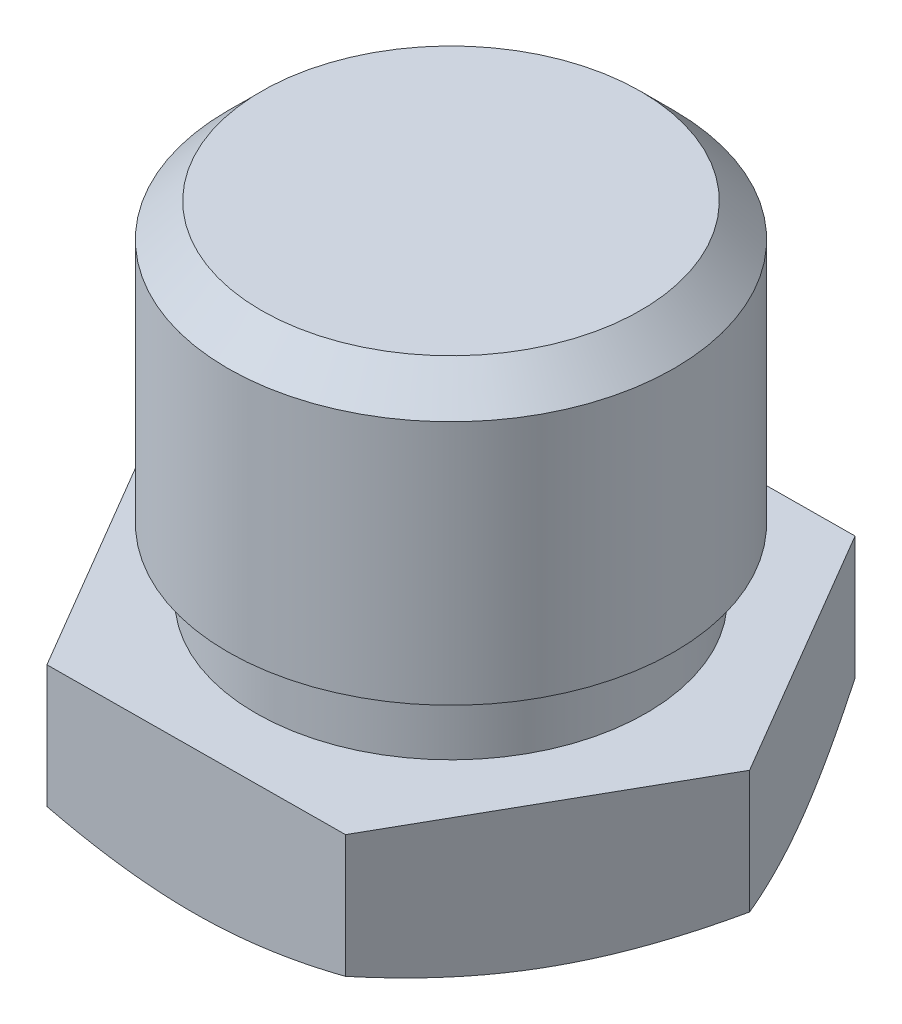
ISO-10303-21;
HEADER;
FILE_DESCRIPTION(('STEP AP214'),'2;1');
FILE_NAME('part.step','',(''),(''),'','','');
FILE_SCHEMA(('AUTOMOTIVE_DESIGN { 1 0 10303 214 1 1 1 1 }'));
ENDSEC;
DATA;
#1=APPLICATION_CONTEXT('core data for automotive mechanical design processes');
#2=APPLICATION_PROTOCOL_DEFINITION('international standard','automotive_design',2000,#1);
#3=PRODUCT_CONTEXT('',#1,'mechanical');
#4=PRODUCT('Part','Part','',(#3));
#5=PRODUCT_RELATED_PRODUCT_CATEGORY('part','',(#4));
#6=PRODUCT_DEFINITION_FORMATION('','',#4);
#7=PRODUCT_DEFINITION_CONTEXT('part definition',#1,'design');
#8=PRODUCT_DEFINITION('design','',#6,#7);
#9=PRODUCT_DEFINITION_SHAPE('','',#8);
#10=(LENGTH_UNIT() NAMED_UNIT(*) SI_UNIT(.MILLI.,.METRE.));
#11=(NAMED_UNIT(*) PLANE_ANGLE_UNIT() SI_UNIT($,.RADIAN.));
#12=(NAMED_UNIT(*) SI_UNIT($,.STERADIAN.) SOLID_ANGLE_UNIT());
#13=UNCERTAINTY_MEASURE_WITH_UNIT(LENGTH_MEASURE(1.E-05),#10,'distance_accuracy_value','');
#14=(GEOMETRIC_REPRESENTATION_CONTEXT(3) GLOBAL_UNCERTAINTY_ASSIGNED_CONTEXT((#13)) GLOBAL_UNIT_ASSIGNED_CONTEXT((#10,
#11,#12)) REPRESENTATION_CONTEXT('',''));
#15=CARTESIAN_POINT('',(0.,0.,0.));
#16=DIRECTION('',(0.,0.,1.));
#17=DIRECTION('',(1.,0.,0.));
#18=AXIS2_PLACEMENT_3D('',#15,#16,#17);
#19=CARTESIAN_POINT('',(13.2786844152626,6.5,-0.0993656540089263));
#20=DIRECTION('',(-0.862259714880802,0.,0.506466370150751));
#21=DIRECTION('',(0.506466370150751,0.,0.862259714880802));
#22=AXIS2_PLACEMENT_3D('',#19,#20,#21);
#23=PLANE('',#22);
#24=DIRECTION('',(0.,-1.,0.));
#25=VECTOR('',#24,1.);
#26=CARTESIAN_POINT('',(13.2786844152626,6.5,-0.0993656540089263));
#27=LINE('',#26,#25);
#28=CARTESIAN_POINT('',(13.2786844152626,6.5,-0.0993656540089263));
#29=VERTEX_POINT('',#28);
#30=CARTESIAN_POINT('',(13.2786844152626,0.999999999999913,-0.0993656540089263));
#31=VERTEX_POINT('',#30);
#32=EDGE_CURVE('E104',#29,#31,#27,.T.);
#33=ORIENTED_EDGE('',*,*,#32,.T.);
#34=CARTESIAN_POINT('',(13.278801889467,1.00005798792879,-0.0991656540089266));
#35=CARTESIAN_POINT('',(13.0892477828478,0.906495480012444,-0.421881789888406));
#36=CARTESIAN_POINT('',(12.8989551950581,0.818485549010916,-0.745855191010019));
#37=CARTESIAN_POINT('',(12.5168543572176,0.655424160118906,-1.39638241040671));
#38=CARTESIAN_POINT('',(12.3250453794867,0.580379375303605,-1.72293746755796));
#39=CARTESIAN_POINT('',(11.9397828409977,0.445101486414631,-2.37884748680155));
#40=CARTESIAN_POINT('',(11.7463272663629,0.384890468454874,-2.70820587752167));
#41=CARTESIAN_POINT('',(11.3582872115426,0.281279927851655,-3.36884462226612));
#42=CARTESIAN_POINT('',(11.1637029318079,0.237877507605416,-3.70012463502266));
#43=CARTESIAN_POINT('',(10.7781213489979,0.170174920080449,-4.35657782767609));
#44=CARTESIAN_POINT('',(10.5871427365605,0.145463994403388,-4.68171918673529));
#45=CARTESIAN_POINT('',(10.2047880025491,0.114463177060262,-5.33267866472373));
#46=CARTESIAN_POINT('',(10.0134118618347,0.108174193966666,-5.65849681623943));
#47=CARTESIAN_POINT('',(9.6309432470842,0.114261147632678,-6.30965017634794));
#48=CARTESIAN_POINT('',(9.43985068958976,0.126616979719078,-6.63498552702868));
#49=CARTESIAN_POINT('',(9.05821021566678,0.169480274015968,-7.28472897620153));
#50=CARTESIAN_POINT('',(8.86766225419606,0.199986188699251,-7.60913715137802));
#51=CARTESIAN_POINT('',(8.49944267573429,0.275586286577359,-8.23603150695678));
#52=CARTESIAN_POINT('',(8.32171553673145,0.319641320413002,-8.53861221366305));
#53=CARTESIAN_POINT('',(7.96725959631279,0.421466529051991,-9.14207395591501));
#54=CARTESIAN_POINT('',(7.7905309034253,0.479238166525155,-9.44295480669108));
#55=CARTESIAN_POINT('',(7.43626366329683,0.607771425592251,-10.0460952864308));
#56=CARTESIAN_POINT('',(7.25873805796857,0.67867070482349,-10.3483328817698));
#57=CARTESIAN_POINT('',(6.90498939101579,0.831480584190287,-10.950590489941));
#58=CARTESIAN_POINT('',(6.72876576088822,0.913386036987412,-11.2506114706506));
#59=CARTESIAN_POINT('',(6.55317155279144,1.00005798792881,-11.5495608594584));
#60=B_SPLINE_CURVE_WITH_KNOTS('',3,(#34,#35,#36,#37,#38,#39,#40,#41,#42,#43,#44,#45,#46,#47,#48,
#49,#50,#51,#52,#53,#54,#55,#56,#57,#58,#59),.UNSPECIFIED.,.F.,.F.,(4,2,2,2,2,2,2,2,2,2,2,2,4),
(0.,1.15741546007654,2.31542487092911,3.47514817024263,4.63467145793502,5.76790726441043,
6.901198961274,8.03326950451839,9.16524353806669,10.2259639835277,11.2867975897379,
12.3594596383154,13.4316217618208),.UNSPECIFIED.);
#61=CARTESIAN_POINT('',(6.55328902699588,0.999999999999936,-11.5493608594584));
#62=VERTEX_POINT('',#61);
#63=EDGE_CURVE('E53',#31,#62,#60,.T.);
#64=ORIENTED_EDGE('',*,*,#63,.T.);
#65=DIRECTION('',(0.,-1.,0.));
#66=VECTOR('',#65,1.);
#67=CARTESIAN_POINT('',(6.55328902699589,6.5,-11.5493608594584));
#68=LINE('',#67,#66);
#69=CARTESIAN_POINT('',(6.55328902699589,6.5,-11.5493608594584));
#70=VERTEX_POINT('',#69);
#71=EDGE_CURVE('E103',#70,#62,#68,.T.);
#72=ORIENTED_EDGE('',*,*,#71,.F.);
#73=DIRECTION('',(-0.506466370150751,0.,-0.862259714880802));
#74=VECTOR('',#73,1.);
#75=CARTESIAN_POINT('',(13.2786844152626,6.5,-0.0993656540089263));
#76=LINE('',#75,#74);
#77=EDGE_CURVE('E132',#29,#70,#76,.T.);
#78=ORIENTED_EDGE('',*,*,#77,.F.);
#79=EDGE_LOOP('',(#33,#64,#72,#78));
#80=FACE_BOUND('',#79,.T.);
#81=ADVANCED_FACE('F38',(#80),#23,.F.);
#82=CARTESIAN_POINT('',(6.55328902699589,6.5,-11.5493608594584));
#83=DIRECTION('',(0.00748288527264228,0.,0.999972002822077));
#84=DIRECTION('',(0.999972002822077,0.,-0.00748288527264229));
#85=AXIS2_PLACEMENT_3D('',#82,#83,#84);
#86=PLANE('',#85);
#87=ORIENTED_EDGE('',*,*,#71,.T.);
#88=CARTESIAN_POINT('',(6.55348902699589,1.00005000196466,-11.5493623560773));
#89=CARTESIAN_POINT('',(6.17923229772127,0.906488004955447,-11.5465617575008));
#90=CARTESIAN_POINT('',(5.80351750874437,0.818478587991021,-11.5437502481253));
#91=CARTESIAN_POINT('',(5.04909540759903,0.655418223151411,-11.5381048360397));
#92=CARTESIAN_POINT('',(4.67038665870723,0.580373948311718,-11.5352709225784));
#93=CARTESIAN_POINT('',(3.90972211150778,0.445097066884958,-11.5295787976773));
#94=CARTESIAN_POINT('',(3.52776233709572,0.384886545907937,-11.5267205564839));
#95=CARTESIAN_POINT('',(2.76161388734343,0.281276966483241,-11.5209873950203));
#96=CARTESIAN_POINT('',(2.37742560777006,0.237875010449097,-11.5181124777116));
#97=CARTESIAN_POINT('',(1.61613116407676,0.170173285486741,-11.5124156392353));
#98=CARTESIAN_POINT('',(1.23906190221761,0.145462761642441,-11.5095939942109));
#99=CARTESIAN_POINT('',(0.484138552019265,0.114462686189678,-11.5039448312311));
#100=CARTESIAN_POINT('',(0.106284425889888,0.108174043157357,-11.5011173129929));
#101=CARTESIAN_POINT('',(-0.648863742889136,0.114261600739779,-11.4954664676744));
#102=CARTESIAN_POINT('',(-1.02615795033378,0.126617696996423,-11.4926431393608));
#103=CARTESIAN_POINT('',(-1.77967101273376,0.16948143639026,-11.4870045296983));
#104=CARTESIAN_POINT('',(-2.15588995662197,0.199987531999137,-11.4841892476838));
#105=CARTESIAN_POINT('',(-2.88290153838933,0.275587568352364,-11.4787489511126));
#106=CARTESIAN_POINT('',(-3.23380381381667,0.319642229755087,-11.4761231161277));
#107=CARTESIAN_POINT('',(-3.93363727744409,0.421466387743175,-11.4708861959905));
#108=CARTESIAN_POINT('',(-4.28256825138991,0.47923734682663,-11.4682751124414));
#109=CARTESIAN_POINT('',(-4.98202913527991,0.607768971979282,-11.4630409803536));
#110=CARTESIAN_POINT('',(-5.33253349355472,0.678667290738526,-11.4604181230205));
#111=CARTESIAN_POINT('',(-6.03097051886239,0.831475033525346,-11.4551916525635));
#112=CARTESIAN_POINT('',(-6.37890430827846,0.913379310541671,-11.4525880310408));
#113=CARTESIAN_POINT('',(-6.72559538826666,1.00005000196464,-11.4499937088305));
#114=B_SPLINE_CURVE_WITH_KNOTS('',3,(#88,#89,#90,#91,#92,#93,#94,#95,#96,#97,#98,#99,#100,#101,
#102,#103,#104,#105,#106,#107,#108,#109,#110,#111,#112,#113),.UNSPECIFIED.,.F.,.F.,(4,2,2,2,2,2,
2,2,2,2,2,2,4),(0.,1.15741306233225,2.31542007088461,3.47514092704066,4.63466177273383,
5.76789534332623,6.90118480460978,8.03325312886427,9.16522494310022,10.225933731874,
11.2867556693873,12.3594057431476,13.4315559193472),.UNSPECIFIED.);
#115=CARTESIAN_POINT('',(-6.72539538826666,0.999999999999913,-11.4499952054494));
#116=VERTEX_POINT('',#115);
#117=EDGE_CURVE('E90',#62,#116,#114,.T.);
#118=ORIENTED_EDGE('',*,*,#117,.T.);
#119=DIRECTION('',(0.,-1.,0.));
#120=VECTOR('',#119,1.);
#121=CARTESIAN_POINT('',(-6.72539538826666,6.5,-11.4499952054494));
#122=LINE('',#121,#120);
#123=CARTESIAN_POINT('',(-6.72539538826666,6.5,-11.4499952054494));
#124=VERTEX_POINT('',#123);
#125=EDGE_CURVE('E109',#124,#116,#122,.T.);
#126=ORIENTED_EDGE('',*,*,#125,.F.);
#127=DIRECTION('',(-0.999972002822077,0.,0.00748288527264229));
#128=VECTOR('',#127,1.);
#129=CARTESIAN_POINT('',(6.55328902699589,6.5,-11.5493608594584));
#130=LINE('',#129,#128);
#131=EDGE_CURVE('E108',#70,#124,#130,.T.);
#132=ORIENTED_EDGE('',*,*,#131,.F.);
#133=EDGE_LOOP('',(#87,#118,#126,#132));
#134=FACE_BOUND('',#133,.T.);
#135=ADVANCED_FACE('F107',(#134),#86,.F.);
#136=CARTESIAN_POINT('',(-6.72539538826666,6.5,-11.4499952054494));
#137=DIRECTION('',(0.869742600153444,0.,0.493505632671326));
#138=DIRECTION('',(0.493505632671326,0.,-0.869742600153445));
#139=AXIS2_PLACEMENT_3D('',#136,#137,#138);
#140=PLANE('',#139);
#141=ORIENTED_EDGE('',*,*,#125,.T.);
#142=CARTESIAN_POINT('',(-6.72528190512059,1.00005748901951,-11.4501952054494));
#143=CARTESIAN_POINT('',(-6.90998520223733,0.906495013021198,-11.1246785036001));
#144=CARTESIAN_POINT('',(-7.0954080822684,0.818485114133238,-10.7978936259216));
#145=CARTESIAN_POINT('',(-7.46773071755255,0.655423789217099,-10.1417210607673));
#146=CARTESIAN_POINT('',(-7.65463118186342,0.580379036261622,-9.81233212366499));
#147=CARTESIAN_POINT('',(-8.0300346068258,0.445101210312064,-9.15073004798871));
#148=CARTESIAN_POINT('',(-8.21853952981428,0.384890223400421,-8.81851345103871));
#149=CARTESIAN_POINT('',(-8.59664939141831,0.281279742845111,-8.15214161573655));
#150=CARTESIAN_POINT('',(-8.78625413471284,0.237877351599687,-7.81798672161351));
#151=CARTESIAN_POINT('',(-9.16196843863417,0.170174817961751,-7.15583676024718));
#152=CARTESIAN_POINT('',(-9.34805978694809,0.145463917388455,-6.82787378995135));
#153=CARTESIAN_POINT('',(-9.72062981965142,0.11446314639355,-6.17126521746428));
#154=CARTESIAN_POINT('',(-9.90710852269132,0.108174184544641,-5.84261958240385));
#155=CARTESIAN_POINT('',(-10.2797895209837,0.114261175939173,-5.18581544679942));
#156=CARTESIAN_POINT('',(-10.4659918975592,0.12661702452909,-4.85765680293364));
#157=CARTESIAN_POINT('',(-10.8378659470453,0.169480346632508,-4.20227481473041));
#158=CARTESIAN_POINT('',(-11.0235376638455,0.199986272618733,-3.87505139304302));
#159=CARTESIAN_POINT('',(-11.3823341688252,0.275586366653234,-3.24271695852426));
#160=CARTESIAN_POINT('',(-11.5555130586223,0.319641377221881,-2.93751059828783));
#161=CARTESIAN_POINT('',(-11.9008980498391,0.421466520223448,-2.32881229693535));
#162=CARTESIAN_POINT('',(-12.0731040455087,0.479238115315458,-2.02532054219103));
#163=CARTESIAN_POINT('',(-12.4183051651242,0.607771272306696,-1.41694629177955));
#164=CARTESIAN_POINT('',(-12.5912876783775,0.678670491534158,-1.11208602089748));
#165=CARTESIAN_POINT('',(-12.9359834959049,0.831480237421918,-0.504602302878869));
#166=CARTESIAN_POINT('',(-13.1076973541314,0.913385616764226,-0.201977879469661));
#167=CARTESIAN_POINT('',(-13.2787978984086,1.00005748901945,0.0995656540089277));
#168=B_SPLINE_CURVE_WITH_KNOTS('',3,(#142,#143,#144,#145,#146,#147,#148,#149,#150,#151,#152,
#153,#154,#155,#156,#157,#158,#159,#160,#161,#162,#163,#164,#165,#166,#167),.UNSPECIFIED.,.F.,
.F.,(4,2,2,2,2,2,2,2,2,2,2,2,4),(0.,1.15741531028125,2.31542457105391,3.47514771773503,
4.63467085286736,5.76790651965949,6.90119807685872,8.03326848147521,9.16524237637546,
10.2259620936075,11.2867949708385,12.3594562713123,13.4316176484328),.UNSPECIFIED.);
#169=CARTESIAN_POINT('',(-13.2786844152626,0.999999999999867,0.0993656540089118));
#170=VERTEX_POINT('',#169);
#171=EDGE_CURVE('E93',#116,#170,#168,.T.);
#172=ORIENTED_EDGE('',*,*,#171,.T.);
#173=DIRECTION('',(0.,-1.,0.));
#174=VECTOR('',#173,1.);
#175=CARTESIAN_POINT('',(-13.2786844152625,6.5,0.0993656540089282));
#176=LINE('',#175,#174);
#177=CARTESIAN_POINT('',(-13.2786844152625,6.5,0.0993656540089282));
#178=VERTEX_POINT('',#177);
#179=EDGE_CURVE('E112',#178,#170,#176,.T.);
#180=ORIENTED_EDGE('',*,*,#179,.F.);
#181=DIRECTION('',(-0.493505632671326,0.,0.869742600153444));
#182=VECTOR('',#181,1.);
#183=CARTESIAN_POINT('',(-6.72539538826666,6.5,-11.4499952054494));
#184=LINE('',#183,#182);
#185=EDGE_CURVE('E129',#124,#178,#184,.T.);
#186=ORIENTED_EDGE('',*,*,#185,.F.);
#187=EDGE_LOOP('',(#141,#172,#180,#186));
#188=FACE_BOUND('',#187,.T.);
#189=ADVANCED_FACE('F186',(#188),#140,.F.);
#190=CARTESIAN_POINT('',(-13.2786844152625,6.5,0.0993656540089282));
#191=DIRECTION('',(0.862259714880802,0.,-0.506466370150751));
#192=DIRECTION('',(-0.506466370150751,0.,-0.862259714880802));
#193=AXIS2_PLACEMENT_3D('',#190,#191,#192);
#194=PLANE('',#193);
#195=ORIENTED_EDGE('',*,*,#179,.T.);
#196=CARTESIAN_POINT('',(-13.278801889467,1.00005798792873,0.0991656540089284));
#197=CARTESIAN_POINT('',(-13.0892477828478,0.906495480012392,0.421881789888409));
#198=CARTESIAN_POINT('',(-12.8989551950581,0.818485549010863,0.745855191010022));
#199=CARTESIAN_POINT('',(-12.5168543572176,0.655424160118849,1.39638241040671));
#200=CARTESIAN_POINT('',(-12.3250453794867,0.580379375303546,1.72293746755796));
#201=CARTESIAN_POINT('',(-11.9397828409977,0.44510148641457,2.37884748680155));
#202=CARTESIAN_POINT('',(-11.7463272663629,0.384890468454813,2.70820587752167));
#203=CARTESIAN_POINT('',(-11.3582872115426,0.281279927851592,3.36884462226613));
#204=CARTESIAN_POINT('',(-11.1637029318079,0.237877507605351,3.70012463502267));
#205=CARTESIAN_POINT('',(-10.7781213489979,0.170174920080382,4.3565778276761));
#206=CARTESIAN_POINT('',(-10.5871427365605,0.14546399440332,4.6817191867353));
#207=CARTESIAN_POINT('',(-10.2047880025491,0.114463177060191,5.33267866472375));
#208=CARTESIAN_POINT('',(-10.0134118618347,0.108174193966594,5.65849681623944));
#209=CARTESIAN_POINT('',(-9.63094324708419,0.114261147632604,6.30965017634795));
#210=CARTESIAN_POINT('',(-9.43985068958975,0.126616979719004,6.6349855270287));
#211=CARTESIAN_POINT('',(-9.05821021566677,0.169480274015891,7.28472897620155));
#212=CARTESIAN_POINT('',(-8.86766225419604,0.199986188699173,7.60913715137804));
#213=CARTESIAN_POINT('',(-8.49944267573428,0.275586286577279,8.2360315069568));
#214=CARTESIAN_POINT('',(-8.32171553673143,0.319641320412921,8.53861221366307));
#215=CARTESIAN_POINT('',(-7.96725959631278,0.421466529051907,9.14207395591502));
#216=CARTESIAN_POINT('',(-7.79053090342528,0.47923816652507,9.44295480669109));
#217=CARTESIAN_POINT('',(-7.43626366329682,0.607771425592162,10.0460952864309));
#218=CARTESIAN_POINT('',(-7.25873805796856,0.678670704823399,10.3483328817698));
#219=CARTESIAN_POINT('',(-6.90498939101578,0.831480584190192,10.950590489941));
#220=CARTESIAN_POINT('',(-6.72876576088821,0.913386036987316,11.2506114706506));
#221=CARTESIAN_POINT('',(-6.55317155279144,1.00005798792871,11.5495608594584));
#222=B_SPLINE_CURVE_WITH_KNOTS('',3,(#196,#197,#198,#199,#200,#201,#202,#203,#204,#205,#206,
#207,#208,#209,#210,#211,#212,#213,#214,#215,#216,#217,#218,#219,#220,#221),.UNSPECIFIED.,.F.,
.F.,(4,2,2,2,2,2,2,2,2,2,2,2,4),(0.,1.15741546007654,2.31542487092912,3.47514817024264,
4.63467145793503,5.76790726441044,6.90119896127402,8.03326950451842,9.16524353806671,
10.2259639835277,11.2867975897379,12.3594596383154,13.4316217618208),.UNSPECIFIED.);
#223=CARTESIAN_POINT('',(-6.5532890269959,0.999999999999844,11.5493608594584));
#224=VERTEX_POINT('',#223);
#225=EDGE_CURVE('E177',#170,#224,#222,.T.);
#226=ORIENTED_EDGE('',*,*,#225,.T.);
#227=DIRECTION('',(0.,-1.,0.));
#228=VECTOR('',#227,1.);
#229=CARTESIAN_POINT('',(-6.55328902699588,6.5,11.5493608594584));
#230=LINE('',#229,#228);
#231=CARTESIAN_POINT('',(-6.55328902699588,6.5,11.5493608594584));
#232=VERTEX_POINT('',#231);
#233=EDGE_CURVE('E117',#232,#224,#230,.T.);
#234=ORIENTED_EDGE('',*,*,#233,.F.);
#235=DIRECTION('',(0.506466370150751,0.,0.862259714880802));
#236=VECTOR('',#235,1.);
#237=CARTESIAN_POINT('',(-13.2786844152625,6.5,0.0993656540089282));
#238=LINE('',#237,#236);
#239=EDGE_CURVE('E127',#178,#232,#238,.T.);
#240=ORIENTED_EDGE('',*,*,#239,.F.);
#241=EDGE_LOOP('',(#195,#226,#234,#240));
#242=FACE_BOUND('',#241,.T.);
#243=ADVANCED_FACE('F189',(#242),#194,.F.);
#244=CARTESIAN_POINT('',(-6.55328902699588,6.5,11.5493608594584));
#245=DIRECTION('',(-0.00748288527264255,0.,-0.999972002822077));
#246=DIRECTION('',(-0.999972002822077,0.,0.00748288527264255));
#247=AXIS2_PLACEMENT_3D('',#244,#245,#246);
#248=PLANE('',#247);
#249=ORIENTED_EDGE('',*,*,#233,.T.);
#250=CARTESIAN_POINT('',(-6.55348902699588,1.00005000196456,11.5493623560773));
#251=CARTESIAN_POINT('',(-6.17923229772126,0.906488004955348,11.5465617575008));
#252=CARTESIAN_POINT('',(-5.80351750874437,0.818478587990924,11.5437502481253));
#253=CARTESIAN_POINT('',(-5.04909540759902,0.655418223151318,11.5381048360397));
#254=CARTESIAN_POINT('',(-4.67038665870722,0.580373948311626,11.5352709225784));
#255=CARTESIAN_POINT('',(-3.90972211150776,0.44509706688487,11.5295787976773));
#256=CARTESIAN_POINT('',(-3.5277623370957,0.384886545907851,11.5267205564839));
#257=CARTESIAN_POINT('',(-2.76161388734341,0.281276966483157,11.5209873950203));
#258=CARTESIAN_POINT('',(-2.37742560777005,0.237875010449014,11.5181124777116));
#259=CARTESIAN_POINT('',(-1.61613116407674,0.170173285486662,11.5124156392353));
#260=CARTESIAN_POINT('',(-1.23906190221759,0.145462761642364,11.5095939942109));
#261=CARTESIAN_POINT('',(-0.484138552019243,0.114462686189606,11.5039448312311));
#262=CARTESIAN_POINT('',(-0.106284425889866,0.108174043157287,11.5011173129929));
#263=CARTESIAN_POINT('',(0.64886374288916,0.114261600739711,11.4954664676744));
#264=CARTESIAN_POINT('',(1.0261579503338,0.126617696996355,11.4926431393608));
#265=CARTESIAN_POINT('',(1.77967101273379,0.169481436390195,11.4870045296983));
#266=CARTESIAN_POINT('',(2.155889956622,0.199987531999075,11.4841892476838));
#267=CARTESIAN_POINT('',(2.88290153838935,0.275587568352305,11.4787489511126));
#268=CARTESIAN_POINT('',(3.23380381381669,0.319642229755029,11.4761231161277));
#269=CARTESIAN_POINT('',(3.93363727744411,0.421466387743119,11.4708861959905));
#270=CARTESIAN_POINT('',(4.28256825138993,0.479237346826575,11.4682751124414));
#271=CARTESIAN_POINT('',(4.98202913527992,0.607768971979228,11.4630409803536));
#272=CARTESIAN_POINT('',(5.33253349355473,0.678667290738473,11.4604181230205));
#273=CARTESIAN_POINT('',(6.0309705188624,0.831475033525294,11.4551916525635));
#274=CARTESIAN_POINT('',(6.37890430827846,0.91337931054162,11.4525880310408));
#275=CARTESIAN_POINT('',(6.72559538826665,1.00005000196459,11.4499937088305));
#276=B_SPLINE_CURVE_WITH_KNOTS('',3,(#250,#251,#252,#253,#254,#255,#256,#257,#258,#259,#260,
#261,#262,#263,#264,#265,#266,#267,#268,#269,#270,#271,#272,#273,#274,#275),.UNSPECIFIED.,.F.,
.F.,(4,2,2,2,2,2,2,2,2,2,2,2,4),(0.,1.15741306233225,2.31542007088462,3.47514092704067,
4.63466177273384,5.76789534332625,6.90118480460979,8.03325312886429,9.16522494310024,
10.2259337318741,11.2867556693873,12.3594057431476,13.4315559193472),.UNSPECIFIED.);
#277=CARTESIAN_POINT('',(6.72539538826665,0.999999999999867,11.4499952054494));
#278=VERTEX_POINT('',#277);
#279=EDGE_CURVE('E170',#224,#278,#276,.T.);
#280=ORIENTED_EDGE('',*,*,#279,.T.);
#281=DIRECTION('',(0.,-1.,0.));
#282=VECTOR('',#281,1.);
#283=CARTESIAN_POINT('',(6.72539538826666,6.5,11.4499952054494));
#284=LINE('',#283,#282);
#285=CARTESIAN_POINT('',(6.72539538826666,6.5,11.4499952054494));
#286=VERTEX_POINT('',#285);
#287=EDGE_CURVE('E120',#286,#278,#284,.T.);
#288=ORIENTED_EDGE('',*,*,#287,.F.);
#289=DIRECTION('',(0.999972002822077,0.,-0.00748288527264255));
#290=VECTOR('',#289,1.);
#291=CARTESIAN_POINT('',(-6.55328902699588,6.5,11.5493608594584));
#292=LINE('',#291,#290);
#293=EDGE_CURVE('E125',#232,#286,#292,.T.);
#294=ORIENTED_EDGE('',*,*,#293,.F.);
#295=EDGE_LOOP('',(#249,#280,#288,#294));
#296=FACE_BOUND('',#295,.T.);
#297=ADVANCED_FACE('F226',(#296),#248,.F.);
#298=CARTESIAN_POINT('',(6.72539538826666,6.5,11.4499952054494));
#299=DIRECTION('',(-0.869742600153444,0.,-0.493505632671326));
#300=DIRECTION('',(-0.493505632671326,0.,0.869742600153444));
#301=AXIS2_PLACEMENT_3D('',#298,#299,#300);
#302=PLANE('',#301);
#303=ORIENTED_EDGE('',*,*,#287,.T.);
#304=CARTESIAN_POINT('',(6.72528190512059,1.00005748901945,11.4501952054494));
#305=CARTESIAN_POINT('',(6.90998520223733,0.906495013021148,11.1246785036001));
#306=CARTESIAN_POINT('',(7.0954080822684,0.818485114133191,10.7978936259216));
#307=CARTESIAN_POINT('',(7.46773071755254,0.655423789217059,10.1417210607673));
#308=CARTESIAN_POINT('',(7.65463118186342,0.580379036261586,9.81233212366499));
#309=CARTESIAN_POINT('',(8.03003460682579,0.445101210312034,9.15073004798871));
#310=CARTESIAN_POINT('',(8.21853952981428,0.384890223400393,8.81851345103871));
#311=CARTESIAN_POINT('',(8.5966493914183,0.281279742845089,8.15214161573655));
#312=CARTESIAN_POINT('',(8.78625413471283,0.237877351599668,7.8179867216135));
#313=CARTESIAN_POINT('',(9.16196843863417,0.170174817961738,7.15583676024718));
#314=CARTESIAN_POINT('',(9.3480597869481,0.145463917388445,6.82787378995134));
#315=CARTESIAN_POINT('',(9.72062981965142,0.114463146393546,6.17126521746428));
#316=CARTESIAN_POINT('',(9.90710852269132,0.108174184544639,5.84261958240385));
#317=CARTESIAN_POINT('',(10.2797895209837,0.114261175939176,5.18581544679942));
#318=CARTESIAN_POINT('',(10.4659918975592,0.126617024529097,4.85765680293364));
#319=CARTESIAN_POINT('',(10.8378659470453,0.169480346632521,4.20227481473041));
#320=CARTESIAN_POINT('',(11.0235376638455,0.199986272618748,3.87505139304302));
#321=CARTESIAN_POINT('',(11.3823341688252,0.275586366653254,3.24271695852426));
#322=CARTESIAN_POINT('',(11.5555130586223,0.319641377221903,2.93751059828783));
#323=CARTESIAN_POINT('',(11.9008980498391,0.421466520223476,2.32881229693535));
#324=CARTESIAN_POINT('',(12.0731040455087,0.47923811531549,2.02532054219103));
#325=CARTESIAN_POINT('',(12.4183051651242,0.607771272306734,1.41694629177955));
#326=CARTESIAN_POINT('',(12.5912876783775,0.678670491534198,1.11208602089748));
#327=CARTESIAN_POINT('',(12.9359834959049,0.831480237421963,0.504602302878869));
#328=CARTESIAN_POINT('',(13.1076973541314,0.913385616764273,0.201977879469661));
#329=CARTESIAN_POINT('',(13.2787978984086,1.0000574890195,-0.0995656540089264));
#330=B_SPLINE_CURVE_WITH_KNOTS('',3,(#304,#305,#306,#307,#308,#309,#310,#311,#312,#313,#314,
#315,#316,#317,#318,#319,#320,#321,#322,#323,#324,#325,#326,#327,#328,#329),.UNSPECIFIED.,.F.,
.F.,(4,2,2,2,2,2,2,2,2,2,2,2,4),(0.,1.15741531028125,2.3154245710539,3.47514771773502,
4.63467085286735,5.76790651965948,6.90119807685872,8.03326848147521,9.16524237637545,
10.2259620936075,11.2867949708385,12.3594562713123,13.4316176484328),.UNSPECIFIED.);
#331=EDGE_CURVE('E161',#278,#31,#330,.T.);
#332=ORIENTED_EDGE('',*,*,#331,.T.);
#333=ORIENTED_EDGE('',*,*,#32,.F.);
#334=DIRECTION('',(0.493505632671326,0.,-0.869742600153444));
#335=VECTOR('',#334,1.);
#336=CARTESIAN_POINT('',(6.72539538826666,6.5,11.4499952054494));
#337=LINE('',#336,#335);
#338=EDGE_CURVE('E61',#286,#29,#337,.T.);
#339=ORIENTED_EDGE('',*,*,#338,.F.);
#340=EDGE_LOOP('',(#303,#332,#333,#339));
#341=FACE_BOUND('',#340,.T.);
#342=ADVANCED_FACE('F235',(#341),#302,.F.);
#343=CARTESIAN_POINT('',(0.,6.5,0.));
#344=DIRECTION('',(0.,1.,0.));
#345=DIRECTION('',(0.,0.,1.));
#346=AXIS2_PLACEMENT_3D('',#343,#344,#345);
#347=PLANE('',#346);
#348=CARTESIAN_POINT('',(0.,6.5,0.));
#349=DIRECTION('',(0.,1.,0.));
#350=DIRECTION('',(0.,0.,1.));
#351=AXIS2_PLACEMENT_3D('',#348,#349,#350);
#352=CIRCLE('',#351,8.75);
#353=CARTESIAN_POINT('',(0.,6.5,8.75));
#354=VERTEX_POINT('',#353);
#355=EDGE_CURVE('E135',#354,#354,#352,.T.);
#356=ORIENTED_EDGE('',*,*,#355,.F.);
#357=EDGE_LOOP('',(#356));
#358=FACE_BOUND('',#357,.T.);
#359=ORIENTED_EDGE('',*,*,#77,.T.);
#360=ORIENTED_EDGE('',*,*,#131,.T.);
#361=ORIENTED_EDGE('',*,*,#185,.T.);
#362=ORIENTED_EDGE('',*,*,#239,.T.);
#363=ORIENTED_EDGE('',*,*,#293,.T.);
#364=ORIENTED_EDGE('',*,*,#338,.T.);
#365=EDGE_LOOP('',(#359,#360,#361,#362,#363,#364));
#366=FACE_BOUND('',#365,.T.);
#367=ADVANCED_FACE('F244',(#358,#366),#347,.T.);
#368=CARTESIAN_POINT('',(0.,9.5,0.));
#369=DIRECTION('',(0.,-1.,0.));
#370=DIRECTION('',(0.,0.,-1.));
#371=AXIS2_PLACEMENT_3D('',#368,#369,#370);
#372=CYLINDRICAL_SURFACE('',#371,8.75);
#373=CARTESIAN_POINT('',(0.,9.5,0.));
#374=DIRECTION('',(0.,1.,0.));
#375=DIRECTION('',(0.,0.,1.));
#376=AXIS2_PLACEMENT_3D('',#373,#374,#375);
#377=CIRCLE('',#376,8.75);
#378=CARTESIAN_POINT('',(0.,9.5,8.75));
#379=VERTEX_POINT('',#378);
#380=EDGE_CURVE('E134',#379,#379,#377,.T.);
#381=ORIENTED_EDGE('',*,*,#380,.F.);
#382=EDGE_LOOP('',(#381));
#383=FACE_BOUND('',#382,.T.);
#384=ORIENTED_EDGE('',*,*,#355,.T.);
#385=EDGE_LOOP('',(#384));
#386=FACE_BOUND('',#385,.T.);
#387=ADVANCED_FACE('F291',(#383,#386),#372,.T.);
#388=CARTESIAN_POINT('',(0.,22.,0.));
#389=DIRECTION('',(0.,-1.,0.));
#390=DIRECTION('',(0.,0.,-1.));
#391=AXIS2_PLACEMENT_3D('',#388,#389,#390);
#392=CYLINDRICAL_SURFACE('',#391,10.);
#393=CARTESIAN_POINT('',(0.,20.5,0.));
#394=DIRECTION('',(0.,1.,0.));
#395=DIRECTION('',(0.,0.,1.));
#396=AXIS2_PLACEMENT_3D('',#393,#394,#395);
#397=CIRCLE('',#396,10.);
#398=CARTESIAN_POINT('',(0.,20.5,10.));
#399=VERTEX_POINT('',#398);
#400=EDGE_CURVE('E11',#399,#399,#397,.F.);
#401=ORIENTED_EDGE('',*,*,#400,.T.);
#402=EDGE_LOOP('',(#401));
#403=FACE_BOUND('',#402,.T.);
#404=CARTESIAN_POINT('',(0.,9.5,0.));
#405=DIRECTION('',(0.,1.,0.));
#406=DIRECTION('',(0.,0.,1.));
#407=AXIS2_PLACEMENT_3D('',#404,#405,#406);
#408=CIRCLE('',#407,10.);
#409=CARTESIAN_POINT('',(0.,9.5,10.));
#410=VERTEX_POINT('',#409);
#411=EDGE_CURVE('E105',#410,#410,#408,.T.);
#412=ORIENTED_EDGE('',*,*,#411,.T.);
#413=EDGE_LOOP('',(#412));
#414=FACE_BOUND('',#413,.T.);
#415=ADVANCED_FACE('F283',(#403,#414),#392,.T.);
#416=CARTESIAN_POINT('',(0.,22.,0.));
#417=DIRECTION('',(0.,1.,0.));
#418=DIRECTION('',(0.,0.,1.));
#419=AXIS2_PLACEMENT_3D('',#416,#417,#418);
#420=PLANE('',#419);
#421=CARTESIAN_POINT('',(0.,22.,0.));
#422=DIRECTION('',(0.,1.,0.));
#423=DIRECTION('',(0.,0.,1.));
#424=AXIS2_PLACEMENT_3D('',#421,#422,#423);
#425=CIRCLE('',#424,8.5);
#426=CARTESIAN_POINT('',(0.,22.,8.5));
#427=VERTEX_POINT('',#426);
#428=EDGE_CURVE('E46',#427,#427,#425,.T.);
#429=ORIENTED_EDGE('',*,*,#428,.T.);
#430=EDGE_LOOP('',(#429));
#431=FACE_BOUND('',#430,.T.);
#432=ADVANCED_FACE('F156',(#431),#420,.T.);
#433=CARTESIAN_POINT('',(0.,9.5,0.));
#434=DIRECTION('',(0.,1.,0.));
#435=DIRECTION('',(0.,0.,1.));
#436=AXIS2_PLACEMENT_3D('',#433,#434,#435);
#437=PLANE('',#436);
#438=ORIENTED_EDGE('',*,*,#380,.T.);
#439=EDGE_LOOP('',(#438));
#440=FACE_BOUND('',#439,.T.);
#441=ORIENTED_EDGE('',*,*,#411,.F.);
#442=EDGE_LOOP('',(#441));
#443=FACE_BOUND('',#442,.T.);
#444=ADVANCED_FACE('F268',(#440,#443),#437,.F.);
#445=CARTESIAN_POINT('',(0.,22.,0.));
#446=DIRECTION('',(0.,-1.,0.));
#447=DIRECTION('',(0.,0.,-1.));
#448=AXIS2_PLACEMENT_3D('',#445,#446,#447);
#449=CONICAL_SURFACE('',#448,8.5,0.785398163397445);
#450=ORIENTED_EDGE('',*,*,#400,.F.);
#451=EDGE_LOOP('',(#450));
#452=FACE_BOUND('',#451,.T.);
#453=ORIENTED_EDGE('',*,*,#428,.F.);
#454=EDGE_LOOP('',(#453));
#455=FACE_BOUND('',#454,.T.);
#456=ADVANCED_FACE('F40',(#452,#455),#449,.T.);
#457=CARTESIAN_POINT('',(0.,0.99999999999989,0.));
#458=DIRECTION('',(0.,1.,0.));
#459=DIRECTION('',(0.,0.,1.));
#460=AXIS2_PLACEMENT_3D('',#457,#458,#459);
#461=CONICAL_SURFACE('',#460,13.2790561913614,1.10714871779413);
#462=CARTESIAN_POINT('',(0.,0.,0.));
#463=DIRECTION('',(0.,-1.,0.));
#464=DIRECTION('',(0.,0.,-1.));
#465=AXIS2_PLACEMENT_3D('',#462,#463,#464);
#466=CIRCLE('',#465,11.2790561913614);
#467=CARTESIAN_POINT('',(0.,0.,-11.2790561913614));
#468=VERTEX_POINT('',#467);
#469=EDGE_CURVE('E328',#468,#468,#466,.T.);
#470=ORIENTED_EDGE('',*,*,#469,.F.);
#471=EDGE_LOOP('',(#470));
#472=FACE_BOUND('',#471,.T.);
#473=ORIENTED_EDGE('',*,*,#331,.F.);
#474=ORIENTED_EDGE('',*,*,#279,.F.);
#475=ORIENTED_EDGE('',*,*,#225,.F.);
#476=ORIENTED_EDGE('',*,*,#171,.F.);
#477=ORIENTED_EDGE('',*,*,#117,.F.);
#478=ORIENTED_EDGE('',*,*,#63,.F.);
#479=EDGE_LOOP('',(#473,#474,#475,#476,#477,#478));
#480=FACE_BOUND('',#479,.T.);
#481=ADVANCED_FACE('F91',(#472,#480),#461,.T.);
#482=CARTESIAN_POINT('',(0.,0.,0.));
#483=DIRECTION('',(0.,1.,0.));
#484=DIRECTION('',(0.,0.,1.));
#485=AXIS2_PLACEMENT_3D('',#482,#483,#484);
#486=PLANE('',#485);
#487=ORIENTED_EDGE('',*,*,#469,.T.);
#488=EDGE_LOOP('',(#487));
#489=FACE_BOUND('',#488,.T.);
#490=ADVANCED_FACE('F154',(#489),#486,.F.);
#491=CLOSED_SHELL('',(#81,#135,#189,#243,#297,#342,#367,#387,#415,#432,#444,#456,#481,#490));
#492=MANIFOLD_SOLID_BREP('B2',#491);
#493=ADVANCED_BREP_SHAPE_REPRESENTATION('',(#18,#492),#14);
#494=SHAPE_DEFINITION_REPRESENTATION(#9,#493);
ENDSEC;
END-ISO-10303-21;
